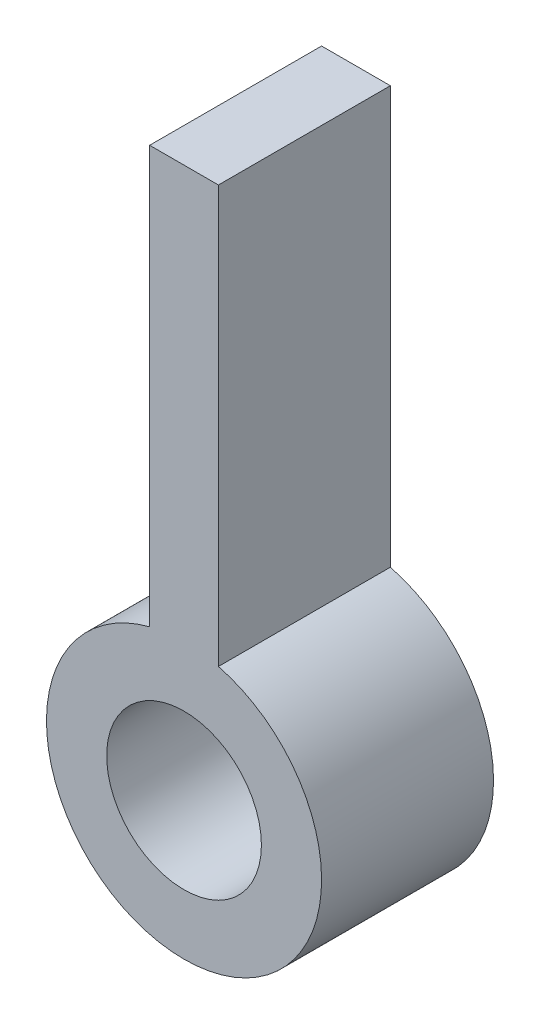
ISO-10303-21;
HEADER;
FILE_DESCRIPTION(('STEP AP214'),'2;1');
FILE_NAME('part.step','',(''),(''),'','','');
FILE_SCHEMA(('AUTOMOTIVE_DESIGN { 1 0 10303 214 1 1 1 1 }'));
ENDSEC;
DATA;
#1=APPLICATION_CONTEXT('core data for automotive mechanical design processes');
#2=APPLICATION_PROTOCOL_DEFINITION('international standard','automotive_design',2000,#1);
#3=PRODUCT_CONTEXT('',#1,'mechanical');
#4=PRODUCT('Part','Part','',(#3));
#5=PRODUCT_RELATED_PRODUCT_CATEGORY('part','',(#4));
#6=PRODUCT_DEFINITION_FORMATION('','',#4);
#7=PRODUCT_DEFINITION_CONTEXT('part definition',#1,'design');
#8=PRODUCT_DEFINITION('design','',#6,#7);
#9=PRODUCT_DEFINITION_SHAPE('','',#8);
#10=(LENGTH_UNIT() NAMED_UNIT(*) SI_UNIT(.MILLI.,.METRE.));
#11=(NAMED_UNIT(*) PLANE_ANGLE_UNIT() SI_UNIT($,.RADIAN.));
#12=(NAMED_UNIT(*) SI_UNIT($,.STERADIAN.) SOLID_ANGLE_UNIT());
#13=UNCERTAINTY_MEASURE_WITH_UNIT(LENGTH_MEASURE(1.E-05),#10,'distance_accuracy_value','');
#14=(GEOMETRIC_REPRESENTATION_CONTEXT(3) GLOBAL_UNCERTAINTY_ASSIGNED_CONTEXT((#13)) GLOBAL_UNIT_ASSIGNED_CONTEXT((#10,
#11,#12)) REPRESENTATION_CONTEXT('',''));
#15=CARTESIAN_POINT('',(0.,0.,0.));
#16=DIRECTION('',(0.,0.,1.));
#17=DIRECTION('',(1.,0.,0.));
#18=AXIS2_PLACEMENT_3D('',#15,#16,#17);
#19=CARTESIAN_POINT('',(0.,0.,5.));
#20=DIRECTION('',(0.,0.,1.));
#21=DIRECTION('',(1.,0.,0.));
#22=AXIS2_PLACEMENT_3D('',#19,#20,#21);
#23=PLANE('',#22);
#24=CARTESIAN_POINT('',(0.,0.,5.));
#25=DIRECTION('',(0.,0.,1.));
#26=DIRECTION('',(1.,0.,0.));
#27=AXIS2_PLACEMENT_3D('',#24,#25,#26);
#28=CIRCLE('',#27,4.);
#29=CARTESIAN_POINT('',(-1.,3.87298334620742,5.));
#30=VERTEX_POINT('',#29);
#31=CARTESIAN_POINT('',(1.,3.87298334620742,5.));
#32=VERTEX_POINT('',#31);
#33=EDGE_CURVE('E91',#30,#32,#28,.T.);
#34=ORIENTED_EDGE('',*,*,#33,.T.);
#35=DIRECTION('',(0.,1.,0.));
#36=VECTOR('',#35,1.);
#37=CARTESIAN_POINT('',(1.,3.87298334620742,5.));
#38=LINE('',#37,#36);
#39=CARTESIAN_POINT('',(1.,16.,5.));
#40=VERTEX_POINT('',#39);
#41=EDGE_CURVE('E86',#32,#40,#38,.T.);
#42=ORIENTED_EDGE('',*,*,#41,.T.);
#43=DIRECTION('',(-1.,0.,0.));
#44=VECTOR('',#43,1.);
#45=CARTESIAN_POINT('',(-1.,16.,5.));
#46=LINE('',#45,#44);
#47=CARTESIAN_POINT('',(-1.,16.,5.));
#48=VERTEX_POINT('',#47);
#49=EDGE_CURVE('E89',#40,#48,#46,.T.);
#50=ORIENTED_EDGE('',*,*,#49,.T.);
#51=DIRECTION('',(0.,-1.,0.));
#52=VECTOR('',#51,1.);
#53=CARTESIAN_POINT('',(-1.,3.87298334620742,5.));
#54=LINE('',#53,#52);
#55=EDGE_CURVE('E56',#48,#30,#54,.T.);
#56=ORIENTED_EDGE('',*,*,#55,.T.);
#57=EDGE_LOOP('',(#34,#42,#50,#56));
#58=FACE_BOUND('',#57,.T.);
#59=CARTESIAN_POINT('',(0.,0.,5.));
#60=DIRECTION('',(0.,0.,1.));
#61=DIRECTION('',(1.,0.,0.));
#62=AXIS2_PLACEMENT_3D('',#59,#60,#61);
#63=CIRCLE('',#62,2.25);
#64=CARTESIAN_POINT('',(2.25,0.,5.));
#65=VERTEX_POINT('',#64);
#66=EDGE_CURVE('E106',#65,#65,#63,.T.);
#67=ORIENTED_EDGE('',*,*,#66,.F.);
#68=EDGE_LOOP('',(#67));
#69=FACE_BOUND('',#68,.T.);
#70=ADVANCED_FACE('F39',(#58,#69),#23,.T.);
#71=CARTESIAN_POINT('',(0.,0.,0.));
#72=DIRECTION('',(0.,0.,1.));
#73=DIRECTION('',(1.,0.,0.));
#74=AXIS2_PLACEMENT_3D('',#71,#72,#73);
#75=PLANE('',#74);
#76=CARTESIAN_POINT('',(0.,0.,0.));
#77=DIRECTION('',(0.,0.,1.));
#78=DIRECTION('',(1.,0.,0.));
#79=AXIS2_PLACEMENT_3D('',#76,#77,#78);
#80=CIRCLE('',#79,4.);
#81=CARTESIAN_POINT('',(-1.,3.87298334620742,0.));
#82=VERTEX_POINT('',#81);
#83=CARTESIAN_POINT('',(1.,3.87298334620742,0.));
#84=VERTEX_POINT('',#83);
#85=EDGE_CURVE('E103',#82,#84,#80,.T.);
#86=ORIENTED_EDGE('',*,*,#85,.F.);
#87=DIRECTION('',(0.,-1.,0.));
#88=VECTOR('',#87,1.);
#89=CARTESIAN_POINT('',(-1.,3.87298334620742,0.));
#90=LINE('',#89,#88);
#91=CARTESIAN_POINT('',(-1.,16.,0.));
#92=VERTEX_POINT('',#91);
#93=EDGE_CURVE('E79',#92,#82,#90,.T.);
#94=ORIENTED_EDGE('',*,*,#93,.F.);
#95=DIRECTION('',(-1.,0.,0.));
#96=VECTOR('',#95,1.);
#97=CARTESIAN_POINT('',(-1.,16.,0.));
#98=LINE('',#97,#96);
#99=CARTESIAN_POINT('',(1.,16.,0.));
#100=VERTEX_POINT('',#99);
#101=EDGE_CURVE('E73',#100,#92,#98,.T.);
#102=ORIENTED_EDGE('',*,*,#101,.F.);
#103=DIRECTION('',(0.,1.,0.));
#104=VECTOR('',#103,1.);
#105=CARTESIAN_POINT('',(1.,3.87298334620742,0.));
#106=LINE('',#105,#104);
#107=EDGE_CURVE('E95',#84,#100,#106,.T.);
#108=ORIENTED_EDGE('',*,*,#107,.F.);
#109=EDGE_LOOP('',(#86,#94,#102,#108));
#110=FACE_BOUND('',#109,.T.);
#111=CARTESIAN_POINT('',(0.,0.,0.));
#112=DIRECTION('',(0.,0.,1.));
#113=DIRECTION('',(1.,0.,0.));
#114=AXIS2_PLACEMENT_3D('',#111,#112,#113);
#115=CIRCLE('',#114,2.25);
#116=CARTESIAN_POINT('',(2.25,0.,0.));
#117=VERTEX_POINT('',#116);
#118=EDGE_CURVE('E118',#117,#117,#115,.T.);
#119=ORIENTED_EDGE('',*,*,#118,.T.);
#120=EDGE_LOOP('',(#119));
#121=FACE_BOUND('',#120,.T.);
#122=ADVANCED_FACE('F114',(#110,#121),#75,.F.);
#123=CARTESIAN_POINT('',(0.,0.,5.));
#124=DIRECTION('',(0.,0.,-1.));
#125=DIRECTION('',(-1.,0.,0.));
#126=AXIS2_PLACEMENT_3D('',#123,#124,#125);
#127=CYLINDRICAL_SURFACE('',#126,4.);
#128=ORIENTED_EDGE('',*,*,#85,.T.);
#129=DIRECTION('',(0.,0.,-1.));
#130=VECTOR('',#129,1.);
#131=CARTESIAN_POINT('',(1.,3.87298334620742,5.));
#132=LINE('',#131,#130);
#133=EDGE_CURVE('E11',#32,#84,#132,.T.);
#134=ORIENTED_EDGE('',*,*,#133,.F.);
#135=ORIENTED_EDGE('',*,*,#33,.F.);
#136=DIRECTION('',(0.,0.,-1.));
#137=VECTOR('',#136,1.);
#138=CARTESIAN_POINT('',(-1.,3.87298334620742,5.));
#139=LINE('',#138,#137);
#140=EDGE_CURVE('E99',#30,#82,#139,.T.);
#141=ORIENTED_EDGE('',*,*,#140,.T.);
#142=EDGE_LOOP('',(#128,#134,#135,#141));
#143=FACE_BOUND('',#142,.T.);
#144=ADVANCED_FACE('F41',(#143),#127,.T.);
#145=CARTESIAN_POINT('',(1.,3.87298334620742,5.));
#146=DIRECTION('',(-1.,0.,0.));
#147=DIRECTION('',(0.,-1.,0.));
#148=AXIS2_PLACEMENT_3D('',#145,#146,#147);
#149=PLANE('',#148);
#150=ORIENTED_EDGE('',*,*,#107,.T.);
#151=DIRECTION('',(0.,0.,-1.));
#152=VECTOR('',#151,1.);
#153=CARTESIAN_POINT('',(1.,16.,5.));
#154=LINE('',#153,#152);
#155=EDGE_CURVE('E48',#40,#100,#154,.T.);
#156=ORIENTED_EDGE('',*,*,#155,.F.);
#157=ORIENTED_EDGE('',*,*,#41,.F.);
#158=ORIENTED_EDGE('',*,*,#133,.T.);
#159=EDGE_LOOP('',(#150,#156,#157,#158));
#160=FACE_BOUND('',#159,.T.);
#161=ADVANCED_FACE('F94',(#160),#149,.F.);
#162=CARTESIAN_POINT('',(-1.,16.,5.));
#163=DIRECTION('',(0.,-1.,0.));
#164=DIRECTION('',(0.,0.,-1.));
#165=AXIS2_PLACEMENT_3D('',#162,#163,#164);
#166=PLANE('',#165);
#167=ORIENTED_EDGE('',*,*,#101,.T.);
#168=DIRECTION('',(0.,0.,-1.));
#169=VECTOR('',#168,1.);
#170=CARTESIAN_POINT('',(-1.,16.,5.));
#171=LINE('',#170,#169);
#172=EDGE_CURVE('E96',#48,#92,#171,.T.);
#173=ORIENTED_EDGE('',*,*,#172,.F.);
#174=ORIENTED_EDGE('',*,*,#49,.F.);
#175=ORIENTED_EDGE('',*,*,#155,.T.);
#176=EDGE_LOOP('',(#167,#173,#174,#175));
#177=FACE_BOUND('',#176,.T.);
#178=ADVANCED_FACE('F97',(#177),#166,.F.);
#179=CARTESIAN_POINT('',(-1.,3.87298334620742,5.));
#180=DIRECTION('',(1.,0.,0.));
#181=DIRECTION('',(0.,1.,0.));
#182=AXIS2_PLACEMENT_3D('',#179,#180,#181);
#183=PLANE('',#182);
#184=ORIENTED_EDGE('',*,*,#93,.T.);
#185=ORIENTED_EDGE('',*,*,#140,.F.);
#186=ORIENTED_EDGE('',*,*,#55,.F.);
#187=ORIENTED_EDGE('',*,*,#172,.T.);
#188=EDGE_LOOP('',(#184,#185,#186,#187));
#189=FACE_BOUND('',#188,.T.);
#190=ADVANCED_FACE('F111',(#189),#183,.F.);
#191=CARTESIAN_POINT('',(0.,0.,5.));
#192=DIRECTION('',(0.,0.,-1.));
#193=DIRECTION('',(-1.,0.,0.));
#194=AXIS2_PLACEMENT_3D('',#191,#192,#193);
#195=CYLINDRICAL_SURFACE('',#194,2.25);
#196=ORIENTED_EDGE('',*,*,#66,.T.);
#197=EDGE_LOOP('',(#196));
#198=FACE_BOUND('',#197,.T.);
#199=ORIENTED_EDGE('',*,*,#118,.F.);
#200=EDGE_LOOP('',(#199));
#201=FACE_BOUND('',#200,.T.);
#202=ADVANCED_FACE('F124',(#198,#201),#195,.F.);
#203=CLOSED_SHELL('',(#70,#122,#144,#161,#178,#190,#202));
#204=MANIFOLD_SOLID_BREP('B2',#203);
#205=ADVANCED_BREP_SHAPE_REPRESENTATION('',(#18,#204),#14);
#206=SHAPE_DEFINITION_REPRESENTATION(#9,#205);
ENDSEC;
END-ISO-10303-21;
